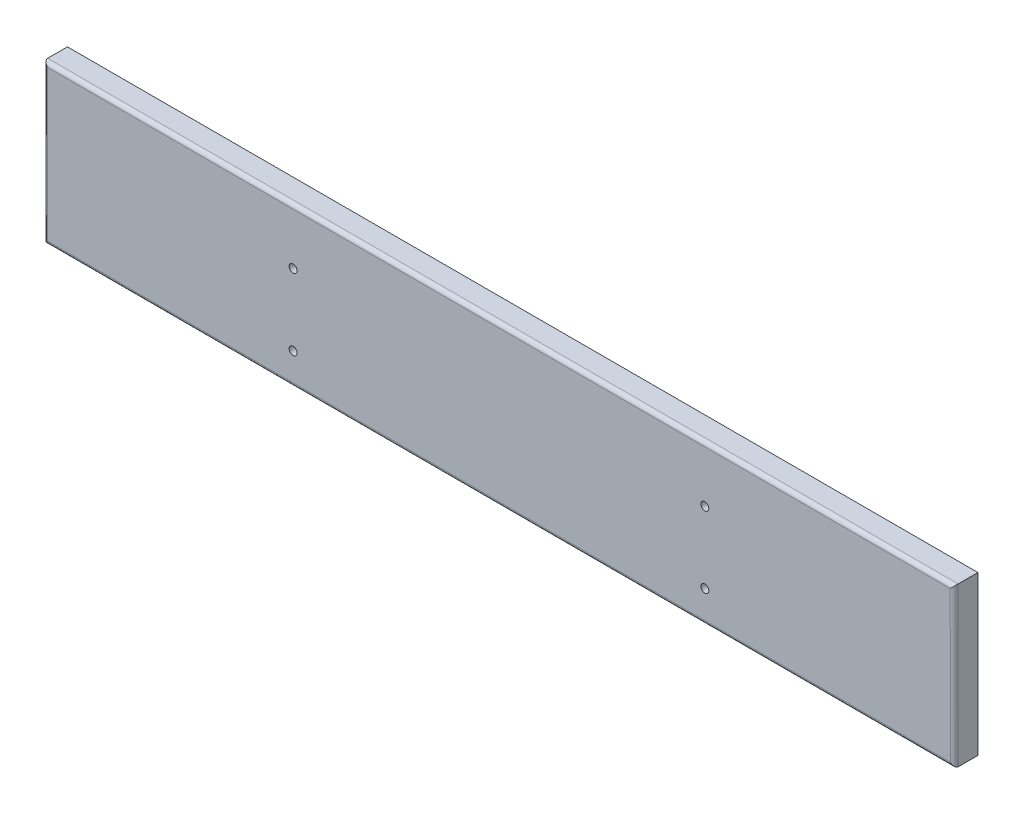
ISO-10303-21;
HEADER;
FILE_DESCRIPTION(('STEP AP214'),'2;1');
FILE_NAME('part.step','',(''),(''),'','','');
FILE_SCHEMA(('AUTOMOTIVE_DESIGN { 1 0 10303 214 1 1 1 1 }'));
ENDSEC;
DATA;
#1=APPLICATION_CONTEXT('core data for automotive mechanical design processes');
#2=APPLICATION_PROTOCOL_DEFINITION('international standard','automotive_design',2000,#1);
#3=PRODUCT_CONTEXT('',#1,'mechanical');
#4=PRODUCT('Part','Part','',(#3));
#5=PRODUCT_RELATED_PRODUCT_CATEGORY('part','',(#4));
#6=PRODUCT_DEFINITION_FORMATION('','',#4);
#7=PRODUCT_DEFINITION_CONTEXT('part definition',#1,'design');
#8=PRODUCT_DEFINITION('design','',#6,#7);
#9=PRODUCT_DEFINITION_SHAPE('','',#8);
#10=(LENGTH_UNIT() NAMED_UNIT(*) SI_UNIT(.MILLI.,.METRE.));
#11=(NAMED_UNIT(*) PLANE_ANGLE_UNIT() SI_UNIT($,.RADIAN.));
#12=(NAMED_UNIT(*) SI_UNIT($,.STERADIAN.) SOLID_ANGLE_UNIT());
#13=UNCERTAINTY_MEASURE_WITH_UNIT(LENGTH_MEASURE(1.E-05),#10,'distance_accuracy_value','');
#14=(GEOMETRIC_REPRESENTATION_CONTEXT(3) GLOBAL_UNCERTAINTY_ASSIGNED_CONTEXT((#13)) GLOBAL_UNIT_ASSIGNED_CONTEXT((#10,
#11,#12)) REPRESENTATION_CONTEXT('',''));
#15=CARTESIAN_POINT('',(0.,0.,0.));
#16=DIRECTION('',(0.,0.,1.));
#17=DIRECTION('',(1.,0.,0.));
#18=AXIS2_PLACEMENT_3D('',#15,#16,#17);
#19=CARTESIAN_POINT('',(-351.452246472205,37.4833628767301,-329.132458287191));
#20=DIRECTION('',(0.,1.,0.));
#21=DIRECTION('',(-1.,0.,0.));
#22=AXIS2_PLACEMENT_3D('',#19,#20,#21);
#23=PLANE('',#22);
#24=DIRECTION('',(0.,0.,-1.));
#25=VECTOR('',#24,1.);
#26=CARTESIAN_POINT('',(378.838596905076,37.4833628767301,-329.132458287191));
#27=LINE('',#26,#25);
#28=CARTESIAN_POINT('',(378.838596905076,37.4833628767301,-332.307458287191));
#29=VERTEX_POINT('',#28);
#30=CARTESIAN_POINT('',(378.838596905076,37.4833628767301,-348.182458287191));
#31=VERTEX_POINT('',#30);
#32=EDGE_CURVE('E88',#29,#31,#27,.T.);
#33=ORIENTED_EDGE('',*,*,#32,.F.);
#34=DIRECTION('',(1.,0.,0.));
#35=VECTOR('',#34,1.);
#36=CARTESIAN_POINT('',(-351.452246472205,37.4833628767301,-332.307458287191));
#37=LINE('',#36,#35);
#38=CARTESIAN_POINT('',(-351.452246472205,37.4833628767301,-332.307458287191));
#39=VERTEX_POINT('',#38);
#40=EDGE_CURVE('E132',#29,#39,#37,.F.);
#41=ORIENTED_EDGE('',*,*,#40,.T.);
#42=DIRECTION('',(0.,0.,-1.));
#43=VECTOR('',#42,1.);
#44=CARTESIAN_POINT('',(-351.452246472205,37.4833628767301,-329.132458287191));
#45=LINE('',#44,#43);
#46=CARTESIAN_POINT('',(-351.452246472205,37.4833628767301,-348.182458287191));
#47=VERTEX_POINT('',#46);
#48=EDGE_CURVE('E101',#39,#47,#45,.T.);
#49=ORIENTED_EDGE('',*,*,#48,.T.);
#50=DIRECTION('',(1.,0.,0.));
#51=VECTOR('',#50,1.);
#52=CARTESIAN_POINT('',(-351.452246472205,37.4833628767301,-348.182458287191));
#53=LINE('',#52,#51);
#54=EDGE_CURVE('E99',#47,#31,#53,.T.);
#55=ORIENTED_EDGE('',*,*,#54,.T.);
#56=EDGE_LOOP('',(#33,#41,#49,#55));
#57=FACE_BOUND('',#56,.T.);
#58=ADVANCED_FACE('F37',(#57),#23,.F.);
#59=CARTESIAN_POINT('',(378.797753527795,164.48336287673,-329.132458287191));
#60=DIRECTION('',(0.999999948286275,0.000321601379283903,0.));
#61=DIRECTION('',(-0.000321601379283903,0.999999948286275,0.));
#62=AXIS2_PLACEMENT_3D('',#59,#60,#61);
#63=PLANE('',#62);
#64=DIRECTION('',(0.,0.,-1.));
#65=VECTOR('',#64,1.);
#66=CARTESIAN_POINT('',(378.797753527795,164.48336287673,-329.132458287191));
#67=LINE('',#66,#65);
#68=CARTESIAN_POINT('',(378.797753527795,164.48336287673,-332.307458287191));
#69=VERTEX_POINT('',#68);
#70=CARTESIAN_POINT('',(378.797753527795,164.48336287673,-348.182458287191));
#71=VERTEX_POINT('',#70);
#72=EDGE_CURVE('E96',#69,#71,#67,.T.);
#73=ORIENTED_EDGE('',*,*,#72,.F.);
#74=DIRECTION('',(0.000321601379283903,-0.999999948286275,0.));
#75=VECTOR('',#74,1.);
#76=CARTESIAN_POINT('',(378.838596905076,37.4833628767301,-332.307458287191));
#77=LINE('',#76,#75);
#78=EDGE_CURVE('E46',#69,#29,#77,.T.);
#79=ORIENTED_EDGE('',*,*,#78,.T.);
#80=ORIENTED_EDGE('',*,*,#32,.T.);
#81=DIRECTION('',(0.000321601379283903,-0.999999948286275,0.));
#82=VECTOR('',#81,1.);
#83=CARTESIAN_POINT('',(378.797753527795,164.48336287673,-348.182458287191));
#84=LINE('',#83,#82);
#85=EDGE_CURVE('E92',#71,#31,#84,.T.);
#86=ORIENTED_EDGE('',*,*,#85,.F.);
#87=EDGE_LOOP('',(#73,#79,#80,#86));
#88=FACE_BOUND('',#87,.T.);
#89=ADVANCED_FACE('F90',(#88),#63,.T.);
#90=CARTESIAN_POINT('',(378.797753527795,164.48336287673,-329.132458287191));
#91=DIRECTION('',(0.,-1.,0.));
#92=DIRECTION('',(0.,0.,-1.));
#93=AXIS2_PLACEMENT_3D('',#90,#91,#92);
#94=PLANE('',#93);
#95=DIRECTION('',(0.,0.,-1.));
#96=VECTOR('',#95,1.);
#97=CARTESIAN_POINT('',(-351.452246472205,164.48336287673,-329.132458287191));
#98=LINE('',#97,#96);
#99=CARTESIAN_POINT('',(-351.452246472205,164.48336287673,-332.307458287191));
#100=VERTEX_POINT('',#99);
#101=CARTESIAN_POINT('',(-351.452246472205,164.48336287673,-348.182458287191));
#102=VERTEX_POINT('',#101);
#103=EDGE_CURVE('E118',#100,#102,#98,.T.);
#104=ORIENTED_EDGE('',*,*,#103,.F.);
#105=DIRECTION('',(-1.,0.,0.));
#106=VECTOR('',#105,1.);
#107=CARTESIAN_POINT('',(378.797753527795,164.48336287673,-332.307458287191));
#108=LINE('',#107,#106);
#109=EDGE_CURVE('E11',#100,#69,#108,.F.);
#110=ORIENTED_EDGE('',*,*,#109,.T.);
#111=ORIENTED_EDGE('',*,*,#72,.T.);
#112=DIRECTION('',(-1.,0.,0.));
#113=VECTOR('',#112,1.);
#114=CARTESIAN_POINT('',(378.797753527795,164.48336287673,-348.182458287191));
#115=LINE('',#114,#113);
#116=EDGE_CURVE('E110',#71,#102,#115,.T.);
#117=ORIENTED_EDGE('',*,*,#116,.T.);
#118=EDGE_LOOP('',(#104,#110,#111,#117));
#119=FACE_BOUND('',#118,.T.);
#120=ADVANCED_FACE('F204',(#119),#94,.F.);
#121=CARTESIAN_POINT('',(-351.452246472205,164.48336287673,-329.132458287191));
#122=DIRECTION('',(1.,0.,0.));
#123=DIRECTION('',(0.,0.,-1.));
#124=AXIS2_PLACEMENT_3D('',#121,#122,#123);
#125=PLANE('',#124);
#126=ORIENTED_EDGE('',*,*,#48,.F.);
#127=DIRECTION('',(0.,-1.,0.));
#128=VECTOR('',#127,1.);
#129=CARTESIAN_POINT('',(-351.452246472205,164.48336287673,-332.307458287191));
#130=LINE('',#129,#128);
#131=EDGE_CURVE('E129',#39,#100,#130,.F.);
#132=ORIENTED_EDGE('',*,*,#131,.T.);
#133=ORIENTED_EDGE('',*,*,#103,.T.);
#134=DIRECTION('',(0.,-1.,0.));
#135=VECTOR('',#134,1.);
#136=CARTESIAN_POINT('',(-351.452246472205,164.48336287673,-348.182458287191));
#137=LINE('',#136,#135);
#138=EDGE_CURVE('E112',#102,#47,#137,.T.);
#139=ORIENTED_EDGE('',*,*,#138,.T.);
#140=EDGE_LOOP('',(#126,#132,#133,#139));
#141=FACE_BOUND('',#140,.T.);
#142=ADVANCED_FACE('F196',(#141),#125,.F.);
#143=CARTESIAN_POINT('',(0.,0.,-329.132458287191));
#144=DIRECTION('',(0.,0.,-1.));
#145=DIRECTION('',(-1.,0.,0.));
#146=AXIS2_PLACEMENT_3D('',#143,#144,#145);
#147=PLANE('',#146);
#148=DIRECTION('',(-1.,0.,0.));
#149=VECTOR('',#148,1.);
#150=CARTESIAN_POINT('',(0.,161.30836287673,-329.132458287191));
#151=LINE('',#150,#149);
#152=CARTESIAN_POINT('',(375.623774448035,161.30836287673,-329.132458287191));
#153=VERTEX_POINT('',#152);
#154=CARTESIAN_POINT('',(-348.277246472205,161.30836287673,-329.132458287191));
#155=VERTEX_POINT('',#154);
#156=EDGE_CURVE('E95',#153,#155,#151,.T.);
#157=ORIENTED_EDGE('',*,*,#156,.T.);
#158=DIRECTION('',(0.,-1.,0.));
#159=VECTOR('',#158,1.);
#160=CARTESIAN_POINT('',(-348.277246472205,0.,-329.132458287191));
#161=LINE('',#160,#159);
#162=CARTESIAN_POINT('',(-348.277246472205,40.6583628767301,-329.132458287191));
#163=VERTEX_POINT('',#162);
#164=EDGE_CURVE('E126',#155,#163,#161,.T.);
#165=ORIENTED_EDGE('',*,*,#164,.T.);
#166=DIRECTION('',(1.,0.,0.));
#167=VECTOR('',#166,1.);
#168=CARTESIAN_POINT('',(0.,40.6583628767301,-329.132458287191));
#169=LINE('',#168,#167);
#170=CARTESIAN_POINT('',(375.662575656453,40.6583628767301,-329.132458287191));
#171=VERTEX_POINT('',#170);
#172=EDGE_CURVE('E124',#163,#171,#169,.T.);
#173=ORIENTED_EDGE('',*,*,#172,.T.);
#174=DIRECTION('',(0.000321601379283903,-0.999999948286275,0.));
#175=VECTOR('',#174,1.);
#176=CARTESIAN_POINT('',(375.622753691986,164.482341792351,-329.132458287191));
#177=LINE('',#176,#175);
#178=EDGE_CURVE('E122',#171,#153,#177,.F.);
#179=ORIENTED_EDGE('',*,*,#178,.T.);
#180=EDGE_LOOP('',(#157,#165,#173,#179));
#181=FACE_BOUND('',#180,.T.);
#182=CARTESIAN_POINT('',(-151.386403094924,120.03336287673,-329.132458287191));
#183=DIRECTION('',(0.,0.,1.));
#184=DIRECTION('',(1.,0.,0.));
#185=AXIS2_PLACEMENT_3D('',#182,#183,#184);
#186=CIRCLE('',#185,3.17499999999998);
#187=CARTESIAN_POINT('',(-148.211403094924,120.03336287673,-329.132458287191));
#188=VERTEX_POINT('',#187);
#189=EDGE_CURVE('E149',#188,#188,#186,.T.);
#190=ORIENTED_EDGE('',*,*,#189,.F.);
#191=EDGE_LOOP('',(#190));
#192=FACE_BOUND('',#191,.T.);
#193=CARTESIAN_POINT('',(-151.386403094924,62.8833628767302,-329.132458287191));
#194=DIRECTION('',(0.,0.,1.));
#195=DIRECTION('',(1.,0.,0.));
#196=AXIS2_PLACEMENT_3D('',#193,#194,#195);
#197=CIRCLE('',#196,3.17499999999998);
#198=CARTESIAN_POINT('',(-148.211403094924,62.8833628767302,-329.132458287191));
#199=VERTEX_POINT('',#198);
#200=EDGE_CURVE('E162',#199,#199,#197,.T.);
#201=ORIENTED_EDGE('',*,*,#200,.F.);
#202=EDGE_LOOP('',(#201));
#203=FACE_BOUND('',#202,.T.);
#204=CARTESIAN_POINT('',(178.813596905076,62.8833628767301,-329.132458287191));
#205=DIRECTION('',(0.,0.,1.));
#206=DIRECTION('',(1.,0.,0.));
#207=AXIS2_PLACEMENT_3D('',#204,#205,#206);
#208=CIRCLE('',#207,3.17499999999998);
#209=CARTESIAN_POINT('',(181.988596905076,62.8833628767301,-329.132458287191));
#210=VERTEX_POINT('',#209);
#211=EDGE_CURVE('E171',#210,#210,#208,.T.);
#212=ORIENTED_EDGE('',*,*,#211,.F.);
#213=EDGE_LOOP('',(#212));
#214=FACE_BOUND('',#213,.T.);
#215=CARTESIAN_POINT('',(178.813596905076,120.03336287673,-329.132458287191));
#216=DIRECTION('',(0.,0.,1.));
#217=DIRECTION('',(1.,0.,0.));
#218=AXIS2_PLACEMENT_3D('',#215,#216,#217);
#219=CIRCLE('',#218,3.17499999999998);
#220=CARTESIAN_POINT('',(181.988596905076,120.03336287673,-329.132458287191));
#221=VERTEX_POINT('',#220);
#222=EDGE_CURVE('E180',#221,#221,#219,.T.);
#223=ORIENTED_EDGE('',*,*,#222,.F.);
#224=EDGE_LOOP('',(#223));
#225=FACE_BOUND('',#224,.T.);
#226=ADVANCED_FACE('F194',(#181,#192,#203,#214,#225),#147,.F.);
#227=CARTESIAN_POINT('',(0.,0.,-348.182458287191));
#228=DIRECTION('',(0.,0.,-1.));
#229=DIRECTION('',(-1.,0.,0.));
#230=AXIS2_PLACEMENT_3D('',#227,#228,#229);
#231=PLANE('',#230);
#232=CARTESIAN_POINT('',(-151.386403094924,120.03336287673,-348.182458287191));
#233=DIRECTION('',(0.,0.,1.));
#234=DIRECTION('',(1.,0.,0.));
#235=AXIS2_PLACEMENT_3D('',#232,#233,#234);
#236=CIRCLE('',#235,3.937);
#237=CARTESIAN_POINT('',(-147.449403094924,120.03336287673,-348.182458287191));
#238=VERTEX_POINT('',#237);
#239=EDGE_CURVE('E144',#238,#238,#236,.T.);
#240=ORIENTED_EDGE('',*,*,#239,.T.);
#241=EDGE_LOOP('',(#240));
#242=FACE_BOUND('',#241,.T.);
#243=CARTESIAN_POINT('',(-151.386403094924,62.8833628767302,-348.182458287191));
#244=DIRECTION('',(0.,0.,1.));
#245=DIRECTION('',(1.,0.,0.));
#246=AXIS2_PLACEMENT_3D('',#243,#244,#245);
#247=CIRCLE('',#246,3.937);
#248=CARTESIAN_POINT('',(-147.449403094924,62.8833628767302,-348.182458287191));
#249=VERTEX_POINT('',#248);
#250=EDGE_CURVE('E159',#249,#249,#247,.T.);
#251=ORIENTED_EDGE('',*,*,#250,.T.);
#252=EDGE_LOOP('',(#251));
#253=FACE_BOUND('',#252,.T.);
#254=CARTESIAN_POINT('',(178.813596905076,62.8833628767301,-348.182458287191));
#255=DIRECTION('',(0.,0.,1.));
#256=DIRECTION('',(1.,0.,0.));
#257=AXIS2_PLACEMENT_3D('',#254,#255,#256);
#258=CIRCLE('',#257,3.937);
#259=CARTESIAN_POINT('',(182.750596905076,62.8833628767301,-348.182458287191));
#260=VERTEX_POINT('',#259);
#261=EDGE_CURVE('E168',#260,#260,#258,.T.);
#262=ORIENTED_EDGE('',*,*,#261,.T.);
#263=EDGE_LOOP('',(#262));
#264=FACE_BOUND('',#263,.T.);
#265=CARTESIAN_POINT('',(178.813596905076,120.03336287673,-348.182458287191));
#266=DIRECTION('',(0.,0.,1.));
#267=DIRECTION('',(1.,0.,0.));
#268=AXIS2_PLACEMENT_3D('',#265,#266,#267);
#269=CIRCLE('',#268,3.937);
#270=CARTESIAN_POINT('',(182.750596905076,120.03336287673,-348.182458287191));
#271=VERTEX_POINT('',#270);
#272=EDGE_CURVE('E177',#271,#271,#269,.T.);
#273=ORIENTED_EDGE('',*,*,#272,.T.);
#274=EDGE_LOOP('',(#273));
#275=FACE_BOUND('',#274,.T.);
#276=ORIENTED_EDGE('',*,*,#54,.F.);
#277=ORIENTED_EDGE('',*,*,#138,.F.);
#278=ORIENTED_EDGE('',*,*,#116,.F.);
#279=ORIENTED_EDGE('',*,*,#85,.T.);
#280=EDGE_LOOP('',(#276,#277,#278,#279));
#281=FACE_BOUND('',#280,.T.);
#282=ADVANCED_FACE('F108',(#242,#253,#264,#275,#281),#231,.T.);
#283=CARTESIAN_POINT('',(178.813596905076,120.03336287673,-347.305877560889));
#284=DIRECTION('',(0.,0.,-1.));
#285=DIRECTION('',(-1.,0.,0.));
#286=AXIS2_PLACEMENT_3D('',#283,#284,#285);
#287=CONICAL_SURFACE('',#286,3.17499999999998,0.715584993317676);
#288=ORIENTED_EDGE('',*,*,#272,.F.);
#289=EDGE_LOOP('',(#288));
#290=FACE_BOUND('',#289,.T.);
#291=CARTESIAN_POINT('',(178.813596905076,120.03336287673,-347.305877560889));
#292=DIRECTION('',(0.,0.,1.));
#293=DIRECTION('',(1.,0.,0.));
#294=AXIS2_PLACEMENT_3D('',#291,#292,#293);
#295=CIRCLE('',#294,3.17499999999998);
#296=CARTESIAN_POINT('',(181.988596905076,120.03336287673,-347.305877560889));
#297=VERTEX_POINT('',#296);
#298=EDGE_CURVE('E105',#297,#297,#295,.T.);
#299=ORIENTED_EDGE('',*,*,#298,.T.);
#300=EDGE_LOOP('',(#299));
#301=FACE_BOUND('',#300,.T.);
#302=ADVANCED_FACE('F185',(#290,#301),#287,.F.);
#303=CARTESIAN_POINT('',(178.813596905076,120.03336287673,-329.132458287191));
#304=DIRECTION('',(0.,0.,1.));
#305=DIRECTION('',(1.,0.,0.));
#306=AXIS2_PLACEMENT_3D('',#303,#304,#305);
#307=CYLINDRICAL_SURFACE('',#306,3.17499999999998);
#308=ORIENTED_EDGE('',*,*,#298,.F.);
#309=EDGE_LOOP('',(#308));
#310=FACE_BOUND('',#309,.T.);
#311=ORIENTED_EDGE('',*,*,#222,.T.);
#312=EDGE_LOOP('',(#311));
#313=FACE_BOUND('',#312,.T.);
#314=ADVANCED_FACE('F187',(#310,#313),#307,.F.);
#315=CARTESIAN_POINT('',(178.813596905076,62.8833628767301,-347.305877560889));
#316=DIRECTION('',(0.,0.,-1.));
#317=DIRECTION('',(-1.,0.,0.));
#318=AXIS2_PLACEMENT_3D('',#315,#316,#317);
#319=CONICAL_SURFACE('',#318,3.17499999999998,0.715584993317676);
#320=ORIENTED_EDGE('',*,*,#261,.F.);
#321=EDGE_LOOP('',(#320));
#322=FACE_BOUND('',#321,.T.);
#323=CARTESIAN_POINT('',(178.813596905076,62.8833628767301,-347.305877560889));
#324=DIRECTION('',(0.,0.,1.));
#325=DIRECTION('',(1.,0.,0.));
#326=AXIS2_PLACEMENT_3D('',#323,#324,#325);
#327=CIRCLE('',#326,3.17499999999998);
#328=CARTESIAN_POINT('',(181.988596905076,62.8833628767301,-347.305877560889));
#329=VERTEX_POINT('',#328);
#330=EDGE_CURVE('E174',#329,#329,#327,.T.);
#331=ORIENTED_EDGE('',*,*,#330,.T.);
#332=EDGE_LOOP('',(#331));
#333=FACE_BOUND('',#332,.T.);
#334=ADVANCED_FACE('F190',(#322,#333),#319,.F.);
#335=CARTESIAN_POINT('',(178.813596905076,62.8833628767301,-329.132458287191));
#336=DIRECTION('',(0.,0.,1.));
#337=DIRECTION('',(1.,0.,0.));
#338=AXIS2_PLACEMENT_3D('',#335,#336,#337);
#339=CYLINDRICAL_SURFACE('',#338,3.17499999999998);
#340=ORIENTED_EDGE('',*,*,#330,.F.);
#341=EDGE_LOOP('',(#340));
#342=FACE_BOUND('',#341,.T.);
#343=ORIENTED_EDGE('',*,*,#211,.T.);
#344=EDGE_LOOP('',(#343));
#345=FACE_BOUND('',#344,.T.);
#346=ADVANCED_FACE('F320',(#342,#345),#339,.F.);
#347=CARTESIAN_POINT('',(-151.386403094924,62.8833628767302,-347.305877560889));
#348=DIRECTION('',(0.,0.,-1.));
#349=DIRECTION('',(-1.,0.,0.));
#350=AXIS2_PLACEMENT_3D('',#347,#348,#349);
#351=CONICAL_SURFACE('',#350,3.17499999999998,0.715584993317676);
#352=ORIENTED_EDGE('',*,*,#250,.F.);
#353=EDGE_LOOP('',(#352));
#354=FACE_BOUND('',#353,.T.);
#355=CARTESIAN_POINT('',(-151.386403094924,62.8833628767302,-347.305877560889));
#356=DIRECTION('',(0.,0.,1.));
#357=DIRECTION('',(1.,0.,0.));
#358=AXIS2_PLACEMENT_3D('',#355,#356,#357);
#359=CIRCLE('',#358,3.17499999999998);
#360=CARTESIAN_POINT('',(-148.211403094924,62.8833628767302,-347.305877560889));
#361=VERTEX_POINT('',#360);
#362=EDGE_CURVE('E165',#361,#361,#359,.T.);
#363=ORIENTED_EDGE('',*,*,#362,.T.);
#364=EDGE_LOOP('',(#363));
#365=FACE_BOUND('',#364,.T.);
#366=ADVANCED_FACE('F310',(#354,#365),#351,.F.);
#367=CARTESIAN_POINT('',(-151.386403094924,62.8833628767302,-329.132458287191));
#368=DIRECTION('',(0.,0.,1.));
#369=DIRECTION('',(1.,0.,0.));
#370=AXIS2_PLACEMENT_3D('',#367,#368,#369);
#371=CYLINDRICAL_SURFACE('',#370,3.17499999999998);
#372=ORIENTED_EDGE('',*,*,#362,.F.);
#373=EDGE_LOOP('',(#372));
#374=FACE_BOUND('',#373,.T.);
#375=ORIENTED_EDGE('',*,*,#200,.T.);
#376=EDGE_LOOP('',(#375));
#377=FACE_BOUND('',#376,.T.);
#378=ADVANCED_FACE('F300',(#374,#377),#371,.F.);
#379=CARTESIAN_POINT('',(-151.386403094924,120.03336287673,-347.305877560889));
#380=DIRECTION('',(0.,0.,-1.));
#381=DIRECTION('',(-1.,0.,0.));
#382=AXIS2_PLACEMENT_3D('',#379,#380,#381);
#383=CONICAL_SURFACE('',#382,3.17499999999998,0.715584993317676);
#384=ORIENTED_EDGE('',*,*,#239,.F.);
#385=EDGE_LOOP('',(#384));
#386=FACE_BOUND('',#385,.T.);
#387=CARTESIAN_POINT('',(-151.386403094924,120.03336287673,-347.305877560889));
#388=DIRECTION('',(0.,0.,1.));
#389=DIRECTION('',(1.,0.,0.));
#390=AXIS2_PLACEMENT_3D('',#387,#388,#389);
#391=CIRCLE('',#390,3.17499999999998);
#392=CARTESIAN_POINT('',(-148.211403094924,120.03336287673,-347.305877560889));
#393=VERTEX_POINT('',#392);
#394=EDGE_CURVE('E154',#393,#393,#391,.T.);
#395=ORIENTED_EDGE('',*,*,#394,.T.);
#396=EDGE_LOOP('',(#395));
#397=FACE_BOUND('',#396,.T.);
#398=ADVANCED_FACE('F233',(#386,#397),#383,.F.);
#399=CARTESIAN_POINT('',(-151.386403094924,120.03336287673,-329.132458287191));
#400=DIRECTION('',(0.,0.,1.));
#401=DIRECTION('',(1.,0.,0.));
#402=AXIS2_PLACEMENT_3D('',#399,#400,#401);
#403=CYLINDRICAL_SURFACE('',#402,3.17499999999998);
#404=ORIENTED_EDGE('',*,*,#394,.F.);
#405=EDGE_LOOP('',(#404));
#406=FACE_BOUND('',#405,.T.);
#407=ORIENTED_EDGE('',*,*,#189,.T.);
#408=EDGE_LOOP('',(#407));
#409=FACE_BOUND('',#408,.T.);
#410=ADVANCED_FACE('F228',(#406,#409),#403,.F.);
#411=CARTESIAN_POINT('',(375.622753691986,164.482341792351,-332.307458287191));
#412=DIRECTION('',(-0.000321601379283903,0.999999948286275,0.));
#413=DIRECTION('',(-0.999999948286275,-0.000321601379283903,0.));
#414=AXIS2_PLACEMENT_3D('',#411,#412,#413);
#415=CYLINDRICAL_SURFACE('',#414,3.175);
#416=CARTESIAN_POINT('',(375.662575656453,40.6583628767301,-332.307458287191));
#417=DIRECTION('',(0.706993068785231,0.707220475304301,0.));
#418=DIRECTION('',(-0.707220475304301,0.706993068785231,0.));
#419=AXIS2_PLACEMENT_3D('',#416,#417,#418);
#420=ELLIPSE('',#419,4.49085025042091,3.175);
#421=EDGE_CURVE('E138',#29,#171,#420,.F.);
#422=ORIENTED_EDGE('',*,*,#421,.F.);
#423=ORIENTED_EDGE('',*,*,#78,.F.);
#424=CARTESIAN_POINT('',(375.623774448035,161.30836287673,-332.307458287191));
#425=DIRECTION('',(-0.707220475304301,0.706993068785231,0.));
#426=DIRECTION('',(-0.706993068785231,-0.707220475304301,0.));
#427=AXIS2_PLACEMENT_3D('',#424,#425,#426);
#428=ELLIPSE('',#427,4.48940621895013,3.175);
#429=EDGE_CURVE('E41',#153,#69,#428,.T.);
#430=ORIENTED_EDGE('',*,*,#429,.F.);
#431=ORIENTED_EDGE('',*,*,#178,.F.);
#432=EDGE_LOOP('',(#422,#423,#430,#431));
#433=FACE_BOUND('',#432,.T.);
#434=ADVANCED_FACE('F39',(#433),#415,.T.);
#435=CARTESIAN_POINT('',(0.,161.30836287673,-332.307458287191));
#436=DIRECTION('',(-1.,0.,0.));
#437=DIRECTION('',(0.,0.,1.));
#438=AXIS2_PLACEMENT_3D('',#435,#436,#437);
#439=CYLINDRICAL_SURFACE('',#438,3.175);
#440=ORIENTED_EDGE('',*,*,#429,.T.);
#441=ORIENTED_EDGE('',*,*,#109,.F.);
#442=CARTESIAN_POINT('',(-348.277246472205,161.30836287673,-332.307458287191));
#443=DIRECTION('',(-0.707106781186547,-0.707106781186547,0.));
#444=DIRECTION('',(-0.707106781186547,0.707106781186547,0.));
#445=AXIS2_PLACEMENT_3D('',#442,#443,#444);
#446=ELLIPSE('',#445,4.49012806053458,3.175);
#447=EDGE_CURVE('E137',#155,#100,#446,.T.);
#448=ORIENTED_EDGE('',*,*,#447,.F.);
#449=ORIENTED_EDGE('',*,*,#156,.F.);
#450=EDGE_LOOP('',(#440,#441,#448,#449));
#451=FACE_BOUND('',#450,.T.);
#452=ADVANCED_FACE('F223',(#451),#439,.T.);
#453=CARTESIAN_POINT('',(0.,40.6583628767301,-332.307458287191));
#454=DIRECTION('',(1.,0.,0.));
#455=DIRECTION('',(0.,1.,0.));
#456=AXIS2_PLACEMENT_3D('',#453,#454,#455);
#457=CYLINDRICAL_SURFACE('',#456,3.175);
#458=ORIENTED_EDGE('',*,*,#421,.T.);
#459=ORIENTED_EDGE('',*,*,#172,.F.);
#460=CARTESIAN_POINT('',(-348.277246472205,40.6583628767301,-332.307458287191));
#461=DIRECTION('',(0.707106781186547,-0.707106781186547,0.));
#462=DIRECTION('',(0.707106781186547,0.707106781186547,0.));
#463=AXIS2_PLACEMENT_3D('',#460,#461,#462);
#464=ELLIPSE('',#463,4.49012806053458,3.175);
#465=EDGE_CURVE('E135',#39,#163,#464,.F.);
#466=ORIENTED_EDGE('',*,*,#465,.F.);
#467=ORIENTED_EDGE('',*,*,#40,.F.);
#468=EDGE_LOOP('',(#458,#459,#466,#467));
#469=FACE_BOUND('',#468,.T.);
#470=ADVANCED_FACE('F220',(#469),#457,.T.);
#471=CARTESIAN_POINT('',(-348.277246472205,0.,-332.307458287191));
#472=DIRECTION('',(0.,-1.,0.));
#473=DIRECTION('',(0.,0.,-1.));
#474=AXIS2_PLACEMENT_3D('',#471,#472,#473);
#475=CYLINDRICAL_SURFACE('',#474,3.175);
#476=ORIENTED_EDGE('',*,*,#447,.T.);
#477=ORIENTED_EDGE('',*,*,#131,.F.);
#478=ORIENTED_EDGE('',*,*,#465,.T.);
#479=ORIENTED_EDGE('',*,*,#164,.F.);
#480=EDGE_LOOP('',(#476,#477,#478,#479));
#481=FACE_BOUND('',#480,.T.);
#482=ADVANCED_FACE('F217',(#481),#475,.T.);
#483=CLOSED_SHELL('',(#58,#89,#120,#142,#226,#282,#302,#314,#334,#346,#366,#378,#398,#410,#434,
#452,#470,#482));
#484=MANIFOLD_SOLID_BREP('B2',#483);
#485=ADVANCED_BREP_SHAPE_REPRESENTATION('',(#18,#484),#14);
#486=SHAPE_DEFINITION_REPRESENTATION(#9,#485);
ENDSEC;
END-ISO-10303-21;
